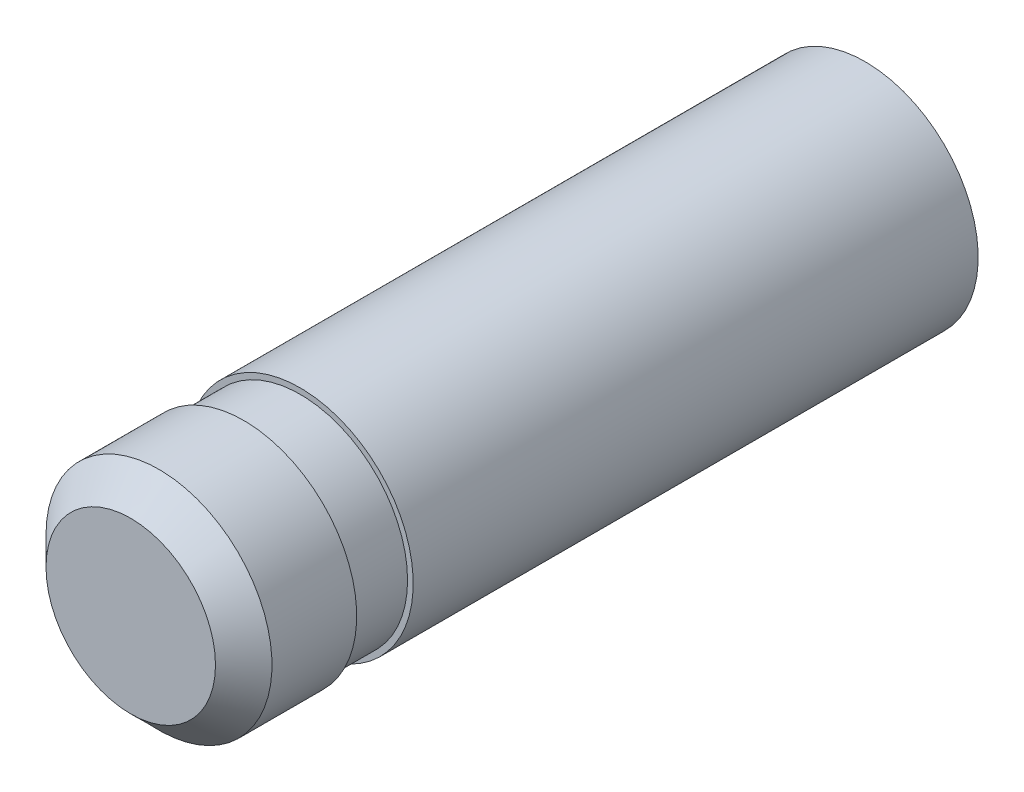
ISO-10303-21;
HEADER;
FILE_DESCRIPTION(('STEP AP214'),'2;1');
FILE_NAME('part.step','',(''),(''),'','','');
FILE_SCHEMA(('AUTOMOTIVE_DESIGN { 1 0 10303 214 1 1 1 1 }'));
ENDSEC;
DATA;
#1=APPLICATION_CONTEXT('core data for automotive mechanical design processes');
#2=APPLICATION_PROTOCOL_DEFINITION('international standard','automotive_design',2000,#1);
#3=PRODUCT_CONTEXT('',#1,'mechanical');
#4=PRODUCT('Part','Part','',(#3));
#5=PRODUCT_RELATED_PRODUCT_CATEGORY('part','',(#4));
#6=PRODUCT_DEFINITION_FORMATION('','',#4);
#7=PRODUCT_DEFINITION_CONTEXT('part definition',#1,'design');
#8=PRODUCT_DEFINITION('design','',#6,#7);
#9=PRODUCT_DEFINITION_SHAPE('','',#8);
#10=(LENGTH_UNIT() NAMED_UNIT(*) SI_UNIT(.MILLI.,.METRE.));
#11=(NAMED_UNIT(*) PLANE_ANGLE_UNIT() SI_UNIT($,.RADIAN.));
#12=(NAMED_UNIT(*) SI_UNIT($,.STERADIAN.) SOLID_ANGLE_UNIT());
#13=UNCERTAINTY_MEASURE_WITH_UNIT(LENGTH_MEASURE(1.E-05),#10,'distance_accuracy_value','');
#14=(GEOMETRIC_REPRESENTATION_CONTEXT(3) GLOBAL_UNCERTAINTY_ASSIGNED_CONTEXT((#13)) GLOBAL_UNIT_ASSIGNED_CONTEXT((#10,
#11,#12)) REPRESENTATION_CONTEXT('',''));
#15=CARTESIAN_POINT('',(0.,0.,0.));
#16=DIRECTION('',(0.,0.,1.));
#17=DIRECTION('',(1.,0.,0.));
#18=AXIS2_PLACEMENT_3D('',#15,#16,#17);
#19=CARTESIAN_POINT('',(0.,0.,13.));
#20=DIRECTION('',(0.,0.,-1.));
#21=DIRECTION('',(-1.,0.,0.));
#22=AXIS2_PLACEMENT_3D('',#19,#20,#21);
#23=CYLINDRICAL_SURFACE('',#22,2.);
#24=CARTESIAN_POINT('',(0.,0.,12.5));
#25=DIRECTION('',(0.,0.,1.));
#26=DIRECTION('',(1.,0.,0.));
#27=AXIS2_PLACEMENT_3D('',#24,#25,#26);
#28=CIRCLE('',#27,2.);
#29=CARTESIAN_POINT('',(-2.,0.,12.5));
#30=VERTEX_POINT('',#29);
#31=EDGE_CURVE('E11',#30,#30,#28,.F.);
#32=CARTESIAN_POINT('',(0.,0.,11.));
#33=DIRECTION('',(0.,0.,-1.));
#34=DIRECTION('',(-1.,0.,0.));
#35=AXIS2_PLACEMENT_3D('',#32,#33,#34);
#36=CIRCLE('',#35,2.);
#37=CARTESIAN_POINT('',(-2.,0.,11.));
#38=VERTEX_POINT('',#37);
#39=EDGE_CURVE('E51',#38,#38,#36,.T.);
#40=CARTESIAN_POINT('',(-2.,0.,12.5));
#41=CARTESIAN_POINT('',(-2.,0.,12.484375));
#42=CARTESIAN_POINT('',(-2.,0.,12.46875));
#43=CARTESIAN_POINT('',(-2.,0.,12.4375));
#44=CARTESIAN_POINT('',(-2.,0.,12.421875));
#45=CARTESIAN_POINT('',(-2.,0.,12.390625));
#46=CARTESIAN_POINT('',(-2.,0.,12.375));
#47=CARTESIAN_POINT('',(-2.,0.,12.34375));
#48=CARTESIAN_POINT('',(-2.,0.,12.328125));
#49=CARTESIAN_POINT('',(-2.,0.,12.296875));
#50=CARTESIAN_POINT('',(-2.,0.,12.28125));
#51=CARTESIAN_POINT('',(-2.,0.,12.25));
#52=CARTESIAN_POINT('',(-2.,0.,12.234375));
#53=CARTESIAN_POINT('',(-2.,0.,12.203125));
#54=CARTESIAN_POINT('',(-2.,0.,12.1875));
#55=CARTESIAN_POINT('',(-2.,0.,12.15625));
#56=CARTESIAN_POINT('',(-2.,0.,12.140625));
#57=CARTESIAN_POINT('',(-2.,0.,12.109375));
#58=CARTESIAN_POINT('',(-2.,0.,12.09375));
#59=CARTESIAN_POINT('',(-2.,0.,12.0625));
#60=CARTESIAN_POINT('',(-2.,0.,12.046875));
#61=CARTESIAN_POINT('',(-2.,0.,12.015625));
#62=CARTESIAN_POINT('',(-2.,0.,12.));
#63=CARTESIAN_POINT('',(-2.,0.,11.96875));
#64=CARTESIAN_POINT('',(-2.,0.,11.953125));
#65=CARTESIAN_POINT('',(-2.,0.,11.921875));
#66=CARTESIAN_POINT('',(-2.,0.,11.90625));
#67=CARTESIAN_POINT('',(-2.,0.,11.875));
#68=CARTESIAN_POINT('',(-2.,0.,11.859375));
#69=CARTESIAN_POINT('',(-2.,0.,11.828125));
#70=CARTESIAN_POINT('',(-2.,0.,11.8125));
#71=CARTESIAN_POINT('',(-2.,0.,11.78125));
#72=CARTESIAN_POINT('',(-2.,0.,11.765625));
#73=CARTESIAN_POINT('',(-2.,0.,11.734375));
#74=CARTESIAN_POINT('',(-2.,0.,11.71875));
#75=CARTESIAN_POINT('',(-2.,0.,11.6875));
#76=CARTESIAN_POINT('',(-2.,0.,11.671875));
#77=CARTESIAN_POINT('',(-2.,0.,11.640625));
#78=CARTESIAN_POINT('',(-2.,0.,11.625));
#79=CARTESIAN_POINT('',(-2.,0.,11.59375));
#80=CARTESIAN_POINT('',(-2.,0.,11.578125));
#81=CARTESIAN_POINT('',(-2.,0.,11.546875));
#82=CARTESIAN_POINT('',(-2.,0.,11.53125));
#83=CARTESIAN_POINT('',(-2.,0.,11.5));
#84=CARTESIAN_POINT('',(-2.,0.,11.484375));
#85=CARTESIAN_POINT('',(-2.,0.,11.453125));
#86=CARTESIAN_POINT('',(-2.,0.,11.4375));
#87=CARTESIAN_POINT('',(-2.,0.,11.40625));
#88=CARTESIAN_POINT('',(-2.,0.,11.390625));
#89=CARTESIAN_POINT('',(-2.,0.,11.359375));
#90=CARTESIAN_POINT('',(-2.,0.,11.34375));
#91=CARTESIAN_POINT('',(-2.,0.,11.3125));
#92=CARTESIAN_POINT('',(-2.,0.,11.296875));
#93=CARTESIAN_POINT('',(-2.,0.,11.265625));
#94=CARTESIAN_POINT('',(-2.,0.,11.25));
#95=CARTESIAN_POINT('',(-2.,0.,11.21875));
#96=CARTESIAN_POINT('',(-2.,0.,11.203125));
#97=CARTESIAN_POINT('',(-2.,0.,11.171875));
#98=CARTESIAN_POINT('',(-2.,0.,11.15625));
#99=CARTESIAN_POINT('',(-2.,0.,11.125));
#100=CARTESIAN_POINT('',(-2.,0.,11.109375));
#101=CARTESIAN_POINT('',(-2.,0.,11.078125));
#102=CARTESIAN_POINT('',(-2.,0.,11.0625));
#103=CARTESIAN_POINT('',(-2.,0.,11.03125));
#104=CARTESIAN_POINT('',(-2.,0.,11.015625));
#105=CARTESIAN_POINT('',(-2.,0.,11.));
#106=B_SPLINE_CURVE_WITH_KNOTS('',3,(#40,#41,#42,#43,#44,#45,#46,#47,#48,#49,#50,#51,#52,#53,
#54,#55,#56,#57,#58,#59,#60,#61,#62,#63,#64,#65,#66,#67,#68,#69,#70,#71,#72,#73,#74,#75,#76,#77,
#78,#79,#80,#81,#82,#83,#84,#85,#86,#87,#88,#89,#90,#91,#92,#93,#94,#95,#96,#97,#98,#99,#100,
#101,#102,#103,#104,#105),.UNSPECIFIED.,.F.,.F.,(4,2,2,2,2,2,2,2,2,2,2,2,2,2,2,2,2,2,2,2,2,2,2,
2,2,2,2,2,2,2,2,2,4),(0.,0.046875,0.0937500000000001,0.140625,0.1875,0.234375,0.28125,0.328125,
0.375,0.421875,0.46875,0.515625,0.5625,0.609375000000001,0.656250000000001,0.703125000000001,
0.750000000000001,0.796875000000001,0.843750000000001,0.890625000000001,0.937500000000001,
0.984375000000001,1.03125,1.078125,1.125,1.171875,1.21875,1.265625,1.3125,1.359375,1.40625,
1.453125,1.5),.UNSPECIFIED.);
#107=EDGE_CURVE('BSEAM35',#30,#38,#106,.T.);
#108=ORIENTED_EDGE('',*,*,#31,.T.);
#109=ORIENTED_EDGE('',*,*,#39,.F.);
#110=ORIENTED_EDGE('',*,*,#107,.T.);
#111=ORIENTED_EDGE('',*,*,#107,.F.);
#112=EDGE_LOOP('',(#108,#110,#109,#111));
#113=FACE_BOUND('',#112,.T.);
#114=ADVANCED_FACE('F35',(#113),#23,.T.);
#115=CARTESIAN_POINT('',(0.,0.,13.));
#116=DIRECTION('',(0.,0.,1.));
#117=DIRECTION('',(1.,0.,0.));
#118=AXIS2_PLACEMENT_3D('',#115,#116,#117);
#119=PLANE('',#118);
#120=CARTESIAN_POINT('',(0.,0.,13.));
#121=DIRECTION('',(0.,0.,1.));
#122=DIRECTION('',(1.,0.,0.));
#123=AXIS2_PLACEMENT_3D('',#120,#121,#122);
#124=CIRCLE('',#123,1.50000000000001);
#125=CARTESIAN_POINT('',(1.50000000000001,0.,13.));
#126=VERTEX_POINT('',#125);
#127=EDGE_CURVE('E43',#126,#126,#124,.T.);
#128=ORIENTED_EDGE('',*,*,#127,.T.);
#129=EDGE_LOOP('',(#128));
#130=FACE_BOUND('',#129,.T.);
#131=ADVANCED_FACE('F73',(#130),#119,.T.);
#132=CARTESIAN_POINT('',(0.,0.,11.));
#133=DIRECTION('',(0.,0.,-1.));
#134=DIRECTION('',(-1.,0.,0.));
#135=AXIS2_PLACEMENT_3D('',#132,#133,#134);
#136=PLANE('',#135);
#137=CARTESIAN_POINT('',(0.,0.,11.));
#138=DIRECTION('',(0.,0.,-1.));
#139=DIRECTION('',(-1.,0.,0.));
#140=AXIS2_PLACEMENT_3D('',#137,#138,#139);
#141=CIRCLE('',#140,1.9);
#142=CARTESIAN_POINT('',(-1.9,0.,11.));
#143=VERTEX_POINT('',#142);
#144=EDGE_CURVE('E58',#143,#143,#141,.T.);
#145=ORIENTED_EDGE('',*,*,#144,.F.);
#146=EDGE_LOOP('',(#145));
#147=FACE_BOUND('',#146,.T.);
#148=ORIENTED_EDGE('',*,*,#39,.T.);
#149=EDGE_LOOP('',(#148));
#150=FACE_BOUND('',#149,.T.);
#151=ADVANCED_FACE('F69',(#147,#150),#136,.T.);
#152=CARTESIAN_POINT('',(0.,0.,10.));
#153=DIRECTION('',(0.,0.,-1.));
#154=DIRECTION('',(-1.,0.,0.));
#155=AXIS2_PLACEMENT_3D('',#152,#153,#154);
#156=PLANE('',#155);
#157=CARTESIAN_POINT('',(0.,0.,10.));
#158=DIRECTION('',(0.,0.,-1.));
#159=DIRECTION('',(-1.,0.,0.));
#160=AXIS2_PLACEMENT_3D('',#157,#158,#159);
#161=CIRCLE('',#160,1.9);
#162=CARTESIAN_POINT('',(-1.9,0.,10.));
#163=VERTEX_POINT('',#162);
#164=EDGE_CURVE('E60',#163,#163,#161,.T.);
#165=ORIENTED_EDGE('',*,*,#164,.T.);
#166=EDGE_LOOP('',(#165));
#167=FACE_BOUND('',#166,.T.);
#168=CARTESIAN_POINT('',(0.,0.,10.));
#169=DIRECTION('',(0.,0.,-1.));
#170=DIRECTION('',(-1.,0.,0.));
#171=AXIS2_PLACEMENT_3D('',#168,#169,#170);
#172=CIRCLE('',#171,2.);
#173=CARTESIAN_POINT('',(-2.,0.,10.));
#174=VERTEX_POINT('',#173);
#175=EDGE_CURVE('E56',#174,#174,#172,.T.);
#176=ORIENTED_EDGE('',*,*,#175,.F.);
#177=EDGE_LOOP('',(#176));
#178=FACE_BOUND('',#177,.T.);
#179=ADVANCED_FACE('F72',(#167,#178),#156,.F.);
#180=CARTESIAN_POINT('',(0.,0.,11.));
#181=DIRECTION('',(0.,0.,-1.));
#182=DIRECTION('',(-1.,0.,0.));
#183=AXIS2_PLACEMENT_3D('',#180,#181,#182);
#184=CYLINDRICAL_SURFACE('',#183,1.9);
#185=ORIENTED_EDGE('',*,*,#144,.T.);
#186=EDGE_LOOP('',(#185));
#187=FACE_BOUND('',#186,.T.);
#188=ORIENTED_EDGE('',*,*,#164,.F.);
#189=EDGE_LOOP('',(#188));
#190=FACE_BOUND('',#189,.T.);
#191=ADVANCED_FACE('F66',(#187,#190),#184,.T.);
#192=CARTESIAN_POINT('',(0.,0.,0.));
#193=DIRECTION('',(0.,0.,1.));
#194=DIRECTION('',(1.,0.,0.));
#195=AXIS2_PLACEMENT_3D('',#192,#193,#194);
#196=PLANE('',#195);
#197=CARTESIAN_POINT('',(0.,0.,0.));
#198=DIRECTION('',(0.,0.,1.));
#199=DIRECTION('',(1.,0.,0.));
#200=AXIS2_PLACEMENT_3D('',#197,#198,#199);
#201=CIRCLE('',#200,2.);
#202=CARTESIAN_POINT('',(-2.,0.,0.));
#203=VERTEX_POINT('',#202);
#204=EDGE_CURVE('E47',#203,#203,#201,.T.);
#205=ORIENTED_EDGE('',*,*,#204,.F.);
#206=EDGE_LOOP('',(#205));
#207=FACE_BOUND('',#206,.T.);
#208=ADVANCED_FACE('F85',(#207),#196,.F.);
#209=CARTESIAN_POINT('',(-2.,0.,10.));
#210=CARTESIAN_POINT('',(-2.,0.,9.89583333333333));
#211=CARTESIAN_POINT('',(-2.,0.,9.79166666666667));
#212=CARTESIAN_POINT('',(-2.,0.,9.58333333333333));
#213=CARTESIAN_POINT('',(-2.,0.,9.47916666666667));
#214=CARTESIAN_POINT('',(-2.,0.,9.27083333333333));
#215=CARTESIAN_POINT('',(-2.,0.,9.16666666666667));
#216=CARTESIAN_POINT('',(-2.,0.,8.95833333333333));
#217=CARTESIAN_POINT('',(-2.,0.,8.85416666666667));
#218=CARTESIAN_POINT('',(-2.,0.,8.64583333333333));
#219=CARTESIAN_POINT('',(-2.,0.,8.54166666666667));
#220=CARTESIAN_POINT('',(-2.,0.,8.33333333333333));
#221=CARTESIAN_POINT('',(-2.,0.,8.22916666666667));
#222=CARTESIAN_POINT('',(-2.,0.,8.02083333333333));
#223=CARTESIAN_POINT('',(-2.,0.,7.91666666666667));
#224=CARTESIAN_POINT('',(-2.,0.,7.70833333333333));
#225=CARTESIAN_POINT('',(-2.,0.,7.60416666666667));
#226=CARTESIAN_POINT('',(-2.,0.,7.39583333333333));
#227=CARTESIAN_POINT('',(-2.,0.,7.29166666666667));
#228=CARTESIAN_POINT('',(-2.,0.,7.08333333333333));
#229=CARTESIAN_POINT('',(-2.,0.,6.97916666666667));
#230=CARTESIAN_POINT('',(-2.,0.,6.77083333333333));
#231=CARTESIAN_POINT('',(-2.,0.,6.66666666666667));
#232=CARTESIAN_POINT('',(-2.,0.,6.45833333333333));
#233=CARTESIAN_POINT('',(-2.,0.,6.35416666666667));
#234=CARTESIAN_POINT('',(-2.,0.,6.14583333333333));
#235=CARTESIAN_POINT('',(-2.,0.,6.04166666666667));
#236=CARTESIAN_POINT('',(-2.,0.,5.83333333333333));
#237=CARTESIAN_POINT('',(-2.,0.,5.72916666666667));
#238=CARTESIAN_POINT('',(-2.,0.,5.52083333333333));
#239=CARTESIAN_POINT('',(-2.,0.,5.41666666666667));
#240=CARTESIAN_POINT('',(-2.,0.,5.20833333333333));
#241=CARTESIAN_POINT('',(-2.,0.,5.10416666666667));
#242=CARTESIAN_POINT('',(-2.,0.,4.89583333333333));
#243=CARTESIAN_POINT('',(-2.,0.,4.79166666666667));
#244=CARTESIAN_POINT('',(-2.,0.,4.58333333333333));
#245=CARTESIAN_POINT('',(-2.,0.,4.47916666666667));
#246=CARTESIAN_POINT('',(-2.,0.,4.27083333333333));
#247=CARTESIAN_POINT('',(-2.,0.,4.16666666666667));
#248=CARTESIAN_POINT('',(-2.,0.,3.95833333333333));
#249=CARTESIAN_POINT('',(-2.,0.,3.85416666666667));
#250=CARTESIAN_POINT('',(-2.,0.,3.64583333333333));
#251=CARTESIAN_POINT('',(-2.,0.,3.54166666666667));
#252=CARTESIAN_POINT('',(-2.,0.,3.33333333333333));
#253=CARTESIAN_POINT('',(-2.,0.,3.22916666666667));
#254=CARTESIAN_POINT('',(-2.,0.,3.02083333333333));
#255=CARTESIAN_POINT('',(-2.,0.,2.91666666666667));
#256=CARTESIAN_POINT('',(-2.,0.,2.70833333333333));
#257=CARTESIAN_POINT('',(-2.,0.,2.60416666666667));
#258=CARTESIAN_POINT('',(-2.,0.,2.39583333333333));
#259=CARTESIAN_POINT('',(-2.,0.,2.29166666666667));
#260=CARTESIAN_POINT('',(-2.,0.,2.08333333333333));
#261=CARTESIAN_POINT('',(-2.,0.,1.97916666666667));
#262=CARTESIAN_POINT('',(-2.,0.,1.77083333333333));
#263=CARTESIAN_POINT('',(-2.,0.,1.66666666666667));
#264=CARTESIAN_POINT('',(-2.,0.,1.45833333333333));
#265=CARTESIAN_POINT('',(-2.,0.,1.35416666666667));
#266=CARTESIAN_POINT('',(-2.,0.,1.14583333333333));
#267=CARTESIAN_POINT('',(-2.,0.,1.04166666666667));
#268=CARTESIAN_POINT('',(-2.,0.,0.833333333333334));
#269=CARTESIAN_POINT('',(-2.,0.,0.729166666666667));
#270=CARTESIAN_POINT('',(-2.,0.,0.520833333333334));
#271=CARTESIAN_POINT('',(-2.,0.,0.416666666666667));
#272=CARTESIAN_POINT('',(-2.,0.,0.208333333333334));
#273=CARTESIAN_POINT('',(-2.,0.,0.104166666666667));
#274=CARTESIAN_POINT('',(-2.,0.,0.));
#275=B_SPLINE_CURVE_WITH_KNOTS('',3,(#209,#210,#211,#212,#213,#214,#215,#216,#217,#218,#219,
#220,#221,#222,#223,#224,#225,#226,#227,#228,#229,#230,#231,#232,#233,#234,#235,#236,#237,#238,
#239,#240,#241,#242,#243,#244,#245,#246,#247,#248,#249,#250,#251,#252,#253,#254,#255,#256,#257,
#258,#259,#260,#261,#262,#263,#264,#265,#266,#267,#268,#269,#270,#271,#272,#273,#274),
.UNSPECIFIED.,.F.,.F.,(4,2,2,2,2,2,2,2,2,2,2,2,2,2,2,2,2,2,2,2,2,2,2,2,2,2,2,2,2,2,2,2,4),(0.,
0.3125,0.624999999999999,0.937499999999999,1.25,1.5625,1.875,2.1875,2.5,2.8125,3.125,3.4375,
3.75,4.0625,4.375,4.6875,5.,5.3125,5.625,5.9375,6.25,6.5625,6.875,7.1875,7.5,7.8125,8.125,
8.4375,8.75,9.0625,9.375,9.6875,10.),.UNSPECIFIED.);
#276=EDGE_CURVE('BSEAM78',#174,#203,#275,.T.);
#277=ORIENTED_EDGE('',*,*,#175,.T.);
#278=ORIENTED_EDGE('',*,*,#204,.T.);
#279=ORIENTED_EDGE('',*,*,#276,.T.);
#280=ORIENTED_EDGE('',*,*,#276,.F.);
#281=EDGE_LOOP('',(#277,#279,#278,#280));
#282=FACE_BOUND('',#281,.T.);
#283=ADVANCED_FACE('F78',(#282),#23,.T.);
#284=CARTESIAN_POINT('',(0.,0.,13.));
#285=DIRECTION('',(0.,0.,-1.));
#286=DIRECTION('',(-1.,0.,0.));
#287=AXIS2_PLACEMENT_3D('',#284,#285,#286);
#288=CONICAL_SURFACE('',#287,1.50000000000001,0.785398163397447);
#289=ORIENTED_EDGE('',*,*,#31,.F.);
#290=EDGE_LOOP('',(#289));
#291=FACE_BOUND('',#290,.T.);
#292=ORIENTED_EDGE('',*,*,#127,.F.);
#293=EDGE_LOOP('',(#292));
#294=FACE_BOUND('',#293,.T.);
#295=ADVANCED_FACE('F38',(#291,#294),#288,.T.);
#296=CLOSED_SHELL('',(#114,#131,#151,#179,#191,#208,#283,#295));
#297=MANIFOLD_SOLID_BREP('B2',#296);
#298=ADVANCED_BREP_SHAPE_REPRESENTATION('',(#18,#297),#14);
#299=SHAPE_DEFINITION_REPRESENTATION(#9,#298);
ENDSEC;
END-ISO-10303-21;
